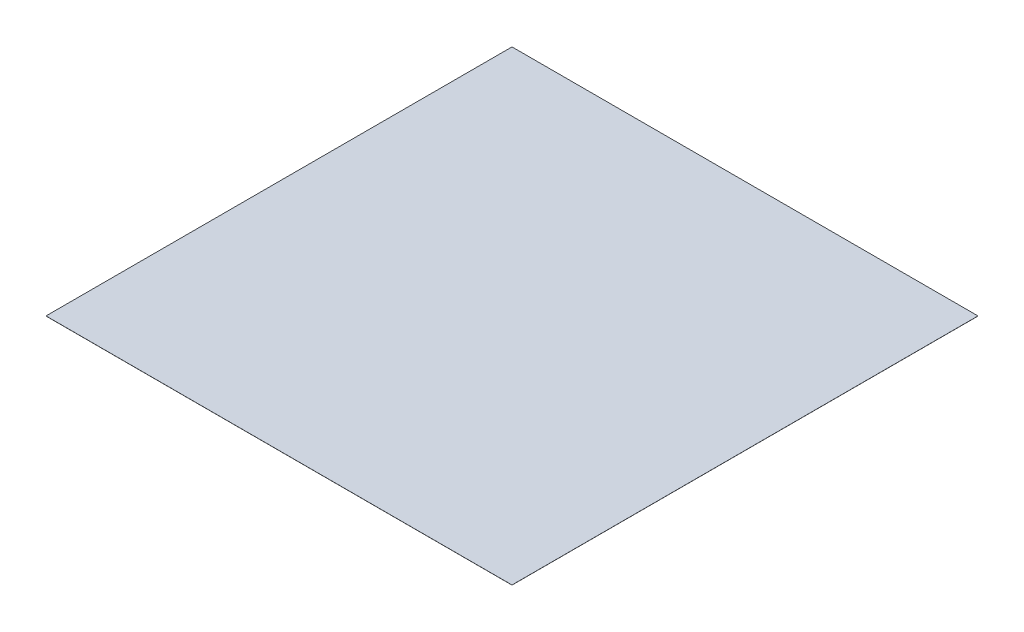
ISO-10303-21;
HEADER;
FILE_DESCRIPTION(('STEP AP214'),'2;1');
FILE_NAME('part.step','',(''),(''),'','','');
FILE_SCHEMA(('AUTOMOTIVE_DESIGN { 1 0 10303 214 1 1 1 1 }'));
ENDSEC;
DATA;
#1=APPLICATION_CONTEXT('core data for automotive mechanical design processes');
#2=APPLICATION_PROTOCOL_DEFINITION('international standard','automotive_design',2000,#1);
#3=PRODUCT_CONTEXT('',#1,'mechanical');
#4=PRODUCT('Part','Part','',(#3));
#5=PRODUCT_RELATED_PRODUCT_CATEGORY('part','',(#4));
#6=PRODUCT_DEFINITION_FORMATION('','',#4);
#7=PRODUCT_DEFINITION_CONTEXT('part definition',#1,'design');
#8=PRODUCT_DEFINITION('design','',#6,#7);
#9=PRODUCT_DEFINITION_SHAPE('','',#8);
#10=(LENGTH_UNIT() NAMED_UNIT(*) SI_UNIT(.MILLI.,.METRE.));
#11=(NAMED_UNIT(*) PLANE_ANGLE_UNIT() SI_UNIT($,.RADIAN.));
#12=(NAMED_UNIT(*) SI_UNIT($,.STERADIAN.) SOLID_ANGLE_UNIT());
#13=UNCERTAINTY_MEASURE_WITH_UNIT(LENGTH_MEASURE(1.E-05),#10,'distance_accuracy_value','');
#14=(GEOMETRIC_REPRESENTATION_CONTEXT(3) GLOBAL_UNCERTAINTY_ASSIGNED_CONTEXT((#13)) GLOBAL_UNIT_ASSIGNED_CONTEXT((#10,
#11,#12)) REPRESENTATION_CONTEXT('',''));
#15=CARTESIAN_POINT('',(0.,0.,0.));
#16=DIRECTION('',(0.,0.,1.));
#17=DIRECTION('',(1.,0.,0.));
#18=AXIS2_PLACEMENT_3D('',#15,#16,#17);
#19=CARTESIAN_POINT('',(200.,0.05,200.));
#20=DIRECTION('',(-1.,0.,0.));
#21=DIRECTION('',(0.,0.,1.));
#22=AXIS2_PLACEMENT_3D('',#19,#20,#21);
#23=PLANE('',#22);
#24=DIRECTION('',(0.,0.,-1.));
#25=VECTOR('',#24,1.);
#26=CARTESIAN_POINT('',(200.,-0.05,200.));
#27=LINE('',#26,#25);
#28=CARTESIAN_POINT('',(200.,-0.05,200.));
#29=VERTEX_POINT('',#28);
#30=CARTESIAN_POINT('',(200.,-0.05,-200.));
#31=VERTEX_POINT('',#30);
#32=EDGE_CURVE('E102',#29,#31,#27,.T.);
#33=ORIENTED_EDGE('',*,*,#32,.T.);
#34=DIRECTION('',(0.,-1.,0.));
#35=VECTOR('',#34,1.);
#36=CARTESIAN_POINT('',(200.,0.05,-200.));
#37=LINE('',#36,#35);
#38=CARTESIAN_POINT('',(200.,0.05,-200.));
#39=VERTEX_POINT('',#38);
#40=EDGE_CURVE('E11',#39,#31,#37,.T.);
#41=ORIENTED_EDGE('',*,*,#40,.F.);
#42=DIRECTION('',(0.,0.,-1.));
#43=VECTOR('',#42,1.);
#44=CARTESIAN_POINT('',(200.,0.05,200.));
#45=LINE('',#44,#43);
#46=CARTESIAN_POINT('',(200.,0.05,200.));
#47=VERTEX_POINT('',#46);
#48=EDGE_CURVE('E90',#47,#39,#45,.T.);
#49=ORIENTED_EDGE('',*,*,#48,.F.);
#50=DIRECTION('',(0.,-1.,0.));
#51=VECTOR('',#50,1.);
#52=CARTESIAN_POINT('',(200.,0.05,200.));
#53=LINE('',#52,#51);
#54=EDGE_CURVE('E98',#47,#29,#53,.T.);
#55=ORIENTED_EDGE('',*,*,#54,.T.);
#56=EDGE_LOOP('',(#33,#41,#49,#55));
#57=FACE_BOUND('',#56,.T.);
#58=ADVANCED_FACE('F39',(#57),#23,.F.);
#59=CARTESIAN_POINT('',(-200.,0.05,-200.));
#60=DIRECTION('',(0.,0.,1.));
#61=DIRECTION('',(1.,0.,0.));
#62=AXIS2_PLACEMENT_3D('',#59,#60,#61);
#63=PLANE('',#62);
#64=DIRECTION('',(-1.,0.,0.));
#65=VECTOR('',#64,1.);
#66=CARTESIAN_POINT('',(-200.,-0.05,-200.));
#67=LINE('',#66,#65);
#68=CARTESIAN_POINT('',(-200.,-0.05,-200.));
#69=VERTEX_POINT('',#68);
#70=EDGE_CURVE('E94',#31,#69,#67,.T.);
#71=ORIENTED_EDGE('',*,*,#70,.T.);
#72=DIRECTION('',(0.,-1.,0.));
#73=VECTOR('',#72,1.);
#74=CARTESIAN_POINT('',(-200.,0.05,-200.));
#75=LINE('',#74,#73);
#76=CARTESIAN_POINT('',(-200.,0.05,-200.));
#77=VERTEX_POINT('',#76);
#78=EDGE_CURVE('E47',#77,#69,#75,.T.);
#79=ORIENTED_EDGE('',*,*,#78,.F.);
#80=DIRECTION('',(-1.,0.,0.));
#81=VECTOR('',#80,1.);
#82=CARTESIAN_POINT('',(-200.,0.05,-200.));
#83=LINE('',#82,#81);
#84=EDGE_CURVE('E85',#39,#77,#83,.T.);
#85=ORIENTED_EDGE('',*,*,#84,.F.);
#86=ORIENTED_EDGE('',*,*,#40,.T.);
#87=EDGE_LOOP('',(#71,#79,#85,#86));
#88=FACE_BOUND('',#87,.T.);
#89=ADVANCED_FACE('F93',(#88),#63,.F.);
#90=CARTESIAN_POINT('',(-200.,0.05,200.));
#91=DIRECTION('',(1.,0.,0.));
#92=DIRECTION('',(0.,0.,-1.));
#93=AXIS2_PLACEMENT_3D('',#90,#91,#92);
#94=PLANE('',#93);
#95=DIRECTION('',(0.,0.,1.));
#96=VECTOR('',#95,1.);
#97=CARTESIAN_POINT('',(-200.,-0.05,200.));
#98=LINE('',#97,#96);
#99=CARTESIAN_POINT('',(-200.,-0.05,200.));
#100=VERTEX_POINT('',#99);
#101=EDGE_CURVE('E72',#69,#100,#98,.T.);
#102=ORIENTED_EDGE('',*,*,#101,.T.);
#103=DIRECTION('',(0.,-1.,0.));
#104=VECTOR('',#103,1.);
#105=CARTESIAN_POINT('',(-200.,0.05,200.));
#106=LINE('',#105,#104);
#107=CARTESIAN_POINT('',(-200.,0.05,200.));
#108=VERTEX_POINT('',#107);
#109=EDGE_CURVE('E95',#108,#100,#106,.T.);
#110=ORIENTED_EDGE('',*,*,#109,.F.);
#111=DIRECTION('',(0.,0.,1.));
#112=VECTOR('',#111,1.);
#113=CARTESIAN_POINT('',(-200.,0.05,200.));
#114=LINE('',#113,#112);
#115=EDGE_CURVE('E88',#77,#108,#114,.T.);
#116=ORIENTED_EDGE('',*,*,#115,.F.);
#117=ORIENTED_EDGE('',*,*,#78,.T.);
#118=EDGE_LOOP('',(#102,#110,#116,#117));
#119=FACE_BOUND('',#118,.T.);
#120=ADVANCED_FACE('F96',(#119),#94,.F.);
#121=CARTESIAN_POINT('',(-200.,0.05,200.));
#122=DIRECTION('',(0.,0.,-1.));
#123=DIRECTION('',(-1.,0.,0.));
#124=AXIS2_PLACEMENT_3D('',#121,#122,#123);
#125=PLANE('',#124);
#126=DIRECTION('',(1.,0.,0.));
#127=VECTOR('',#126,1.);
#128=CARTESIAN_POINT('',(-200.,-0.05,200.));
#129=LINE('',#128,#127);
#130=EDGE_CURVE('E78',#100,#29,#129,.T.);
#131=ORIENTED_EDGE('',*,*,#130,.T.);
#132=ORIENTED_EDGE('',*,*,#54,.F.);
#133=DIRECTION('',(1.,0.,0.));
#134=VECTOR('',#133,1.);
#135=CARTESIAN_POINT('',(-200.,0.05,200.));
#136=LINE('',#135,#134);
#137=EDGE_CURVE('E55',#108,#47,#136,.T.);
#138=ORIENTED_EDGE('',*,*,#137,.F.);
#139=ORIENTED_EDGE('',*,*,#109,.T.);
#140=EDGE_LOOP('',(#131,#132,#138,#139));
#141=FACE_BOUND('',#140,.T.);
#142=ADVANCED_FACE('F109',(#141),#125,.F.);
#143=CARTESIAN_POINT('',(0.,0.05,0.));
#144=DIRECTION('',(0.,-1.,0.));
#145=DIRECTION('',(0.,0.,-1.));
#146=AXIS2_PLACEMENT_3D('',#143,#144,#145);
#147=PLANE('',#146);
#148=ORIENTED_EDGE('',*,*,#48,.T.);
#149=ORIENTED_EDGE('',*,*,#84,.T.);
#150=ORIENTED_EDGE('',*,*,#115,.T.);
#151=ORIENTED_EDGE('',*,*,#137,.T.);
#152=EDGE_LOOP('',(#148,#149,#150,#151));
#153=FACE_BOUND('',#152,.T.);
#154=ADVANCED_FACE('F86',(#153),#147,.F.);
#155=CARTESIAN_POINT('',(0.,-0.05,0.));
#156=DIRECTION('',(0.,-1.,0.));
#157=DIRECTION('',(0.,0.,-1.));
#158=AXIS2_PLACEMENT_3D('',#155,#156,#157);
#159=PLANE('',#158);
#160=ORIENTED_EDGE('',*,*,#32,.F.);
#161=ORIENTED_EDGE('',*,*,#130,.F.);
#162=ORIENTED_EDGE('',*,*,#101,.F.);
#163=ORIENTED_EDGE('',*,*,#70,.F.);
#164=EDGE_LOOP('',(#160,#161,#162,#163));
#165=FACE_BOUND('',#164,.T.);
#166=ADVANCED_FACE('F112',(#165),#159,.T.);
#167=CLOSED_SHELL('',(#58,#89,#120,#142,#154,#166));
#168=MANIFOLD_SOLID_BREP('B2',#167);
#169=ADVANCED_BREP_SHAPE_REPRESENTATION('',(#18,#168),#14);
#170=SHAPE_DEFINITION_REPRESENTATION(#9,#169);
ENDSEC;
END-ISO-10303-21;
